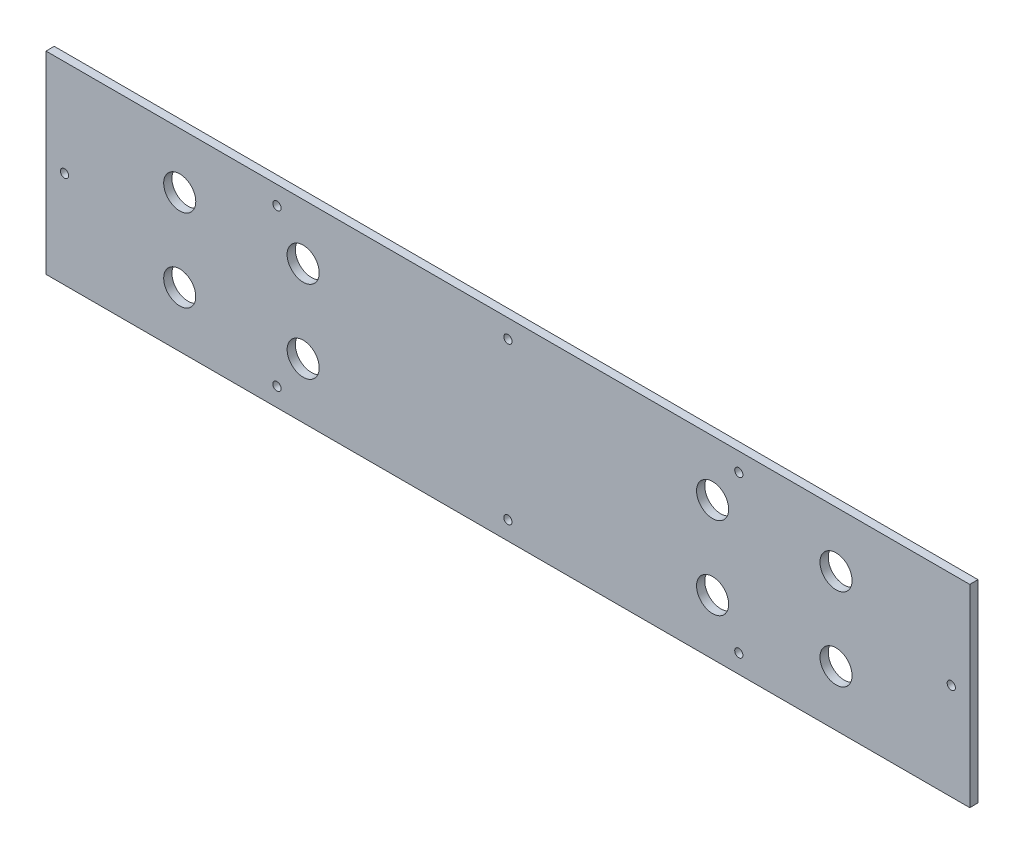
ISO-10303-21;
HEADER;
FILE_DESCRIPTION(('STEP AP214'),'2;1');
FILE_NAME('part.step','',(''),(''),'','','');
FILE_SCHEMA(('AUTOMOTIVE_DESIGN { 1 0 10303 214 1 1 1 1 }'));
ENDSEC;
DATA;
#1=APPLICATION_CONTEXT('core data for automotive mechanical design processes');
#2=APPLICATION_PROTOCOL_DEFINITION('international standard','automotive_design',2000,#1);
#3=PRODUCT_CONTEXT('',#1,'mechanical');
#4=PRODUCT('Part','Part','',(#3));
#5=PRODUCT_RELATED_PRODUCT_CATEGORY('part','',(#4));
#6=PRODUCT_DEFINITION_FORMATION('','',#4);
#7=PRODUCT_DEFINITION_CONTEXT('part definition',#1,'design');
#8=PRODUCT_DEFINITION('design','',#6,#7);
#9=PRODUCT_DEFINITION_SHAPE('','',#8);
#10=(LENGTH_UNIT() NAMED_UNIT(*) SI_UNIT(.MILLI.,.METRE.));
#11=(NAMED_UNIT(*) PLANE_ANGLE_UNIT() SI_UNIT($,.RADIAN.));
#12=(NAMED_UNIT(*) SI_UNIT($,.STERADIAN.) SOLID_ANGLE_UNIT());
#13=UNCERTAINTY_MEASURE_WITH_UNIT(LENGTH_MEASURE(1.E-05),#10,'distance_accuracy_value','');
#14=(GEOMETRIC_REPRESENTATION_CONTEXT(3) GLOBAL_UNCERTAINTY_ASSIGNED_CONTEXT((#13)) GLOBAL_UNIT_ASSIGNED_CONTEXT((#10,
#11,#12)) REPRESENTATION_CONTEXT('',''));
#15=CARTESIAN_POINT('',(0.,0.,0.));
#16=DIRECTION('',(0.,0.,1.));
#17=DIRECTION('',(1.,0.,0.));
#18=AXIS2_PLACEMENT_3D('',#15,#16,#17);
#19=CARTESIAN_POINT('',(0.,0.,4.));
#20=DIRECTION('',(0.,0.,1.));
#21=DIRECTION('',(1.,0.,0.));
#22=AXIS2_PLACEMENT_3D('',#19,#20,#21);
#23=PLANE('',#22);
#24=CARTESIAN_POINT('',(-125.,26.9999999999999,4.));
#25=DIRECTION('',(0.,0.,1.));
#26=DIRECTION('',(-1.,0.,0.));
#27=AXIS2_PLACEMENT_3D('',#24,#25,#26);
#28=CIRCLE('',#27,7.8);
#29=CARTESIAN_POINT('',(-132.8,26.9999999999999,4.));
#30=VERTEX_POINT('',#29);
#31=EDGE_CURVE('E195',#30,#30,#28,.T.);
#32=ORIENTED_EDGE('',*,*,#31,.F.);
#33=EDGE_LOOP('',(#32));
#34=FACE_BOUND('',#33,.T.);
#35=CARTESIAN_POINT('',(-65.,66.9999999999999,4.));
#36=DIRECTION('',(0.,0.,1.));
#37=DIRECTION('',(1.,0.,0.));
#38=AXIS2_PLACEMENT_3D('',#35,#36,#37);
#39=CIRCLE('',#38,7.8);
#40=CARTESIAN_POINT('',(-57.2,66.9999999999999,4.));
#41=VERTEX_POINT('',#40);
#42=EDGE_CURVE('E183',#41,#41,#39,.T.);
#43=ORIENTED_EDGE('',*,*,#42,.F.);
#44=EDGE_LOOP('',(#43));
#45=FACE_BOUND('',#44,.T.);
#46=CARTESIAN_POINT('',(-112.25,8.99999999999618,4.));
#47=DIRECTION('',(0.,0.,1.));
#48=DIRECTION('',(1.,0.,0.));
#49=AXIS2_PLACEMENT_3D('',#46,#47,#48);
#50=CIRCLE('',#49,2.);
#51=CARTESIAN_POINT('',(-110.25,8.99999999999618,4.));
#52=VERTEX_POINT('',#51);
#53=EDGE_CURVE('E171',#52,#52,#50,.T.);
#54=ORIENTED_EDGE('',*,*,#53,.F.);
#55=EDGE_LOOP('',(#54));
#56=FACE_BOUND('',#55,.T.);
#57=CARTESIAN_POINT('',(-336.75,85.0000000000039,4.));
#58=DIRECTION('',(0.,0.,1.));
#59=DIRECTION('',(1.,0.,0.));
#60=AXIS2_PLACEMENT_3D('',#57,#58,#59);
#61=CIRCLE('',#60,2.);
#62=CARTESIAN_POINT('',(-334.75,85.0000000000039,4.));
#63=VERTEX_POINT('',#62);
#64=EDGE_CURVE('E159',#63,#63,#61,.T.);
#65=ORIENTED_EDGE('',*,*,#64,.F.);
#66=EDGE_LOOP('',(#65));
#67=FACE_BOUND('',#66,.T.);
#68=CARTESIAN_POINT('',(-384.,66.9999999999999,4.));
#69=DIRECTION('',(0.,0.,1.));
#70=DIRECTION('',(1.,0.,0.));
#71=AXIS2_PLACEMENT_3D('',#68,#69,#70);
#72=CIRCLE('',#71,7.79999999999999);
#73=CARTESIAN_POINT('',(-376.2,66.9999999999999,4.));
#74=VERTEX_POINT('',#73);
#75=EDGE_CURVE('E147',#74,#74,#72,.T.);
#76=ORIENTED_EDGE('',*,*,#75,.F.);
#77=EDGE_LOOP('',(#76));
#78=FACE_BOUND('',#77,.T.);
#79=CARTESIAN_POINT('',(-224.5,8.99999999999998,4.));
#80=DIRECTION('',(0.,0.,1.));
#81=DIRECTION('',(-1.,0.,0.));
#82=AXIS2_PLACEMENT_3D('',#79,#80,#81);
#83=CIRCLE('',#82,2.);
#84=CARTESIAN_POINT('',(-226.5,8.99999999999998,4.));
#85=VERTEX_POINT('',#84);
#86=EDGE_CURVE('E135',#85,#85,#83,.T.);
#87=ORIENTED_EDGE('',*,*,#86,.F.);
#88=EDGE_LOOP('',(#87));
#89=FACE_BOUND('',#88,.T.);
#90=CARTESIAN_POINT('',(-9.,46.9999999999999,4.));
#91=DIRECTION('',(0.,0.,1.));
#92=DIRECTION('',(1.,0.,0.));
#93=AXIS2_PLACEMENT_3D('',#90,#91,#92);
#94=CIRCLE('',#93,2.);
#95=CARTESIAN_POINT('',(-7.,46.9999999999999,4.));
#96=VERTEX_POINT('',#95);
#97=EDGE_CURVE('E123',#96,#96,#94,.T.);
#98=ORIENTED_EDGE('',*,*,#97,.F.);
#99=EDGE_LOOP('',(#98));
#100=FACE_BOUND('',#99,.T.);
#101=CARTESIAN_POINT('',(-384.,26.9999999999999,4.));
#102=DIRECTION('',(0.,0.,1.));
#103=DIRECTION('',(-1.,0.,0.));
#104=AXIS2_PLACEMENT_3D('',#101,#102,#103);
#105=CIRCLE('',#104,7.79999999999999);
#106=CARTESIAN_POINT('',(-391.8,26.9999999999999,4.));
#107=VERTEX_POINT('',#106);
#108=EDGE_CURVE('E102',#107,#107,#105,.T.);
#109=ORIENTED_EDGE('',*,*,#108,.F.);
#110=EDGE_LOOP('',(#109));
#111=FACE_BOUND('',#110,.T.);
#112=DIRECTION('',(0.,1.,0.));
#113=VECTOR('',#112,1.);
#114=CARTESIAN_POINT('',(0.,0.,4.));
#115=LINE('',#114,#113);
#116=CARTESIAN_POINT('',(0.,0.,4.));
#117=VERTEX_POINT('',#116);
#118=CARTESIAN_POINT('',(0.,93.9999999999999,4.));
#119=VERTEX_POINT('',#118);
#120=EDGE_CURVE('E87',#117,#119,#115,.T.);
#121=ORIENTED_EDGE('',*,*,#120,.T.);
#122=DIRECTION('',(-1.,0.,0.));
#123=VECTOR('',#122,1.);
#124=CARTESIAN_POINT('',(0.,93.9999999999999,4.));
#125=LINE('',#124,#123);
#126=CARTESIAN_POINT('',(-449.,93.9999999999999,4.));
#127=VERTEX_POINT('',#126);
#128=EDGE_CURVE('E82',#119,#127,#125,.T.);
#129=ORIENTED_EDGE('',*,*,#128,.T.);
#130=DIRECTION('',(0.,-1.,0.));
#131=VECTOR('',#130,1.);
#132=CARTESIAN_POINT('',(-449.,0.,4.));
#133=LINE('',#132,#131);
#134=CARTESIAN_POINT('',(-449.,0.,4.));
#135=VERTEX_POINT('',#134);
#136=EDGE_CURVE('E85',#127,#135,#133,.T.);
#137=ORIENTED_EDGE('',*,*,#136,.T.);
#138=DIRECTION('',(1.,0.,0.));
#139=VECTOR('',#138,1.);
#140=CARTESIAN_POINT('',(0.,0.,4.));
#141=LINE('',#140,#139);
#142=EDGE_CURVE('E52',#135,#117,#141,.T.);
#143=ORIENTED_EDGE('',*,*,#142,.T.);
#144=EDGE_LOOP('',(#121,#129,#137,#143));
#145=FACE_BOUND('',#144,.T.);
#146=CARTESIAN_POINT('',(-224.5,84.9999999999999,4.));
#147=DIRECTION('',(0.,0.,1.));
#148=DIRECTION('',(1.,0.,0.));
#149=AXIS2_PLACEMENT_3D('',#146,#147,#148);
#150=CIRCLE('',#149,2.);
#151=CARTESIAN_POINT('',(-222.5,84.9999999999999,4.));
#152=VERTEX_POINT('',#151);
#153=EDGE_CURVE('E117',#152,#152,#150,.T.);
#154=ORIENTED_EDGE('',*,*,#153,.F.);
#155=EDGE_LOOP('',(#154));
#156=FACE_BOUND('',#155,.T.);
#157=CARTESIAN_POINT('',(-440.,46.9999999999999,4.));
#158=DIRECTION('',(0.,0.,1.));
#159=DIRECTION('',(-1.,0.,0.));
#160=AXIS2_PLACEMENT_3D('',#157,#158,#159);
#161=CIRCLE('',#160,2.);
#162=CARTESIAN_POINT('',(-442.,46.9999999999999,4.));
#163=VERTEX_POINT('',#162);
#164=EDGE_CURVE('E129',#163,#163,#161,.T.);
#165=ORIENTED_EDGE('',*,*,#164,.F.);
#166=EDGE_LOOP('',(#165));
#167=FACE_BOUND('',#166,.T.);
#168=CARTESIAN_POINT('',(-324.,26.9999999999999,4.));
#169=DIRECTION('',(0.,0.,1.));
#170=DIRECTION('',(1.,0.,0.));
#171=AXIS2_PLACEMENT_3D('',#168,#169,#170);
#172=CIRCLE('',#171,7.79999999999999);
#173=CARTESIAN_POINT('',(-316.2,26.9999999999999,4.));
#174=VERTEX_POINT('',#173);
#175=EDGE_CURVE('E141',#174,#174,#172,.T.);
#176=ORIENTED_EDGE('',*,*,#175,.F.);
#177=EDGE_LOOP('',(#176));
#178=FACE_BOUND('',#177,.T.);
#179=CARTESIAN_POINT('',(-324.,66.9999999999999,4.));
#180=DIRECTION('',(0.,0.,1.));
#181=DIRECTION('',(-1.,0.,0.));
#182=AXIS2_PLACEMENT_3D('',#179,#180,#181);
#183=CIRCLE('',#182,7.79999999999999);
#184=CARTESIAN_POINT('',(-331.8,66.9999999999999,4.));
#185=VERTEX_POINT('',#184);
#186=EDGE_CURVE('E153',#185,#185,#183,.T.);
#187=ORIENTED_EDGE('',*,*,#186,.F.);
#188=EDGE_LOOP('',(#187));
#189=FACE_BOUND('',#188,.T.);
#190=CARTESIAN_POINT('',(-336.75,8.99999999999596,4.));
#191=DIRECTION('',(0.,0.,1.));
#192=DIRECTION('',(-1.,0.,0.));
#193=AXIS2_PLACEMENT_3D('',#190,#191,#192);
#194=CIRCLE('',#193,2.);
#195=CARTESIAN_POINT('',(-338.75,8.99999999999596,4.));
#196=VERTEX_POINT('',#195);
#197=EDGE_CURVE('E165',#196,#196,#194,.T.);
#198=ORIENTED_EDGE('',*,*,#197,.F.);
#199=EDGE_LOOP('',(#198));
#200=FACE_BOUND('',#199,.T.);
#201=CARTESIAN_POINT('',(-112.25,85.0000000000041,4.));
#202=DIRECTION('',(0.,0.,1.));
#203=DIRECTION('',(-1.,0.,0.));
#204=AXIS2_PLACEMENT_3D('',#201,#202,#203);
#205=CIRCLE('',#204,2.);
#206=CARTESIAN_POINT('',(-114.25,85.0000000000041,4.));
#207=VERTEX_POINT('',#206);
#208=EDGE_CURVE('E177',#207,#207,#205,.T.);
#209=ORIENTED_EDGE('',*,*,#208,.F.);
#210=EDGE_LOOP('',(#209));
#211=FACE_BOUND('',#210,.T.);
#212=CARTESIAN_POINT('',(-65.,26.9999999999999,4.));
#213=DIRECTION('',(0.,0.,1.));
#214=DIRECTION('',(1.,0.,0.));
#215=AXIS2_PLACEMENT_3D('',#212,#213,#214);
#216=CIRCLE('',#215,7.8);
#217=CARTESIAN_POINT('',(-57.2,26.9999999999999,4.));
#218=VERTEX_POINT('',#217);
#219=EDGE_CURVE('E189',#218,#218,#216,.T.);
#220=ORIENTED_EDGE('',*,*,#219,.F.);
#221=EDGE_LOOP('',(#220));
#222=FACE_BOUND('',#221,.T.);
#223=CARTESIAN_POINT('',(-125.,66.9999999999999,4.));
#224=DIRECTION('',(0.,0.,1.));
#225=DIRECTION('',(-1.,0.,0.));
#226=AXIS2_PLACEMENT_3D('',#223,#224,#225);
#227=CIRCLE('',#226,7.8);
#228=CARTESIAN_POINT('',(-132.8,66.9999999999999,4.));
#229=VERTEX_POINT('',#228);
#230=EDGE_CURVE('E201',#229,#229,#227,.T.);
#231=ORIENTED_EDGE('',*,*,#230,.F.);
#232=EDGE_LOOP('',(#231));
#233=FACE_BOUND('',#232,.T.);
#234=ADVANCED_FACE('F35',(#34,#45,#56,#67,#78,#89,#100,#111,#145,#156,#167,#178,#189,#200,#211,
#222,#233),#23,.T.);
#235=CARTESIAN_POINT('',(0.,0.,0.));
#236=DIRECTION('',(0.,0.,1.));
#237=DIRECTION('',(1.,0.,0.));
#238=AXIS2_PLACEMENT_3D('',#235,#236,#237);
#239=PLANE('',#238);
#240=CARTESIAN_POINT('',(-125.,26.9999999999999,0.));
#241=DIRECTION('',(0.,0.,1.));
#242=DIRECTION('',(-1.,0.,0.));
#243=AXIS2_PLACEMENT_3D('',#240,#241,#242);
#244=CIRCLE('',#243,7.8);
#245=CARTESIAN_POINT('',(-132.8,26.9999999999999,0.));
#246=VERTEX_POINT('',#245);
#247=EDGE_CURVE('E198',#246,#246,#244,.T.);
#248=ORIENTED_EDGE('',*,*,#247,.T.);
#249=EDGE_LOOP('',(#248));
#250=FACE_BOUND('',#249,.T.);
#251=CARTESIAN_POINT('',(-65.,66.9999999999999,0.));
#252=DIRECTION('',(0.,0.,1.));
#253=DIRECTION('',(1.,0.,0.));
#254=AXIS2_PLACEMENT_3D('',#251,#252,#253);
#255=CIRCLE('',#254,7.8);
#256=CARTESIAN_POINT('',(-57.2,66.9999999999999,0.));
#257=VERTEX_POINT('',#256);
#258=EDGE_CURVE('E186',#257,#257,#255,.T.);
#259=ORIENTED_EDGE('',*,*,#258,.T.);
#260=EDGE_LOOP('',(#259));
#261=FACE_BOUND('',#260,.T.);
#262=CARTESIAN_POINT('',(-112.25,8.99999999999618,0.));
#263=DIRECTION('',(0.,0.,1.));
#264=DIRECTION('',(1.,0.,0.));
#265=AXIS2_PLACEMENT_3D('',#262,#263,#264);
#266=CIRCLE('',#265,2.);
#267=CARTESIAN_POINT('',(-110.25,8.99999999999618,0.));
#268=VERTEX_POINT('',#267);
#269=EDGE_CURVE('E174',#268,#268,#266,.T.);
#270=ORIENTED_EDGE('',*,*,#269,.T.);
#271=EDGE_LOOP('',(#270));
#272=FACE_BOUND('',#271,.T.);
#273=CARTESIAN_POINT('',(-336.75,85.0000000000039,0.));
#274=DIRECTION('',(0.,0.,1.));
#275=DIRECTION('',(1.,0.,0.));
#276=AXIS2_PLACEMENT_3D('',#273,#274,#275);
#277=CIRCLE('',#276,2.);
#278=CARTESIAN_POINT('',(-334.75,85.0000000000039,0.));
#279=VERTEX_POINT('',#278);
#280=EDGE_CURVE('E162',#279,#279,#277,.T.);
#281=ORIENTED_EDGE('',*,*,#280,.T.);
#282=EDGE_LOOP('',(#281));
#283=FACE_BOUND('',#282,.T.);
#284=CARTESIAN_POINT('',(-384.,66.9999999999999,0.));
#285=DIRECTION('',(0.,0.,1.));
#286=DIRECTION('',(1.,0.,0.));
#287=AXIS2_PLACEMENT_3D('',#284,#285,#286);
#288=CIRCLE('',#287,7.79999999999999);
#289=CARTESIAN_POINT('',(-376.2,66.9999999999999,0.));
#290=VERTEX_POINT('',#289);
#291=EDGE_CURVE('E150',#290,#290,#288,.T.);
#292=ORIENTED_EDGE('',*,*,#291,.T.);
#293=EDGE_LOOP('',(#292));
#294=FACE_BOUND('',#293,.T.);
#295=CARTESIAN_POINT('',(-224.5,8.99999999999998,0.));
#296=DIRECTION('',(0.,0.,1.));
#297=DIRECTION('',(-1.,0.,0.));
#298=AXIS2_PLACEMENT_3D('',#295,#296,#297);
#299=CIRCLE('',#298,2.);
#300=CARTESIAN_POINT('',(-226.5,8.99999999999998,0.));
#301=VERTEX_POINT('',#300);
#302=EDGE_CURVE('E138',#301,#301,#299,.T.);
#303=ORIENTED_EDGE('',*,*,#302,.T.);
#304=EDGE_LOOP('',(#303));
#305=FACE_BOUND('',#304,.T.);
#306=CARTESIAN_POINT('',(-9.,46.9999999999999,0.));
#307=DIRECTION('',(0.,0.,1.));
#308=DIRECTION('',(1.,0.,0.));
#309=AXIS2_PLACEMENT_3D('',#306,#307,#308);
#310=CIRCLE('',#309,2.);
#311=CARTESIAN_POINT('',(-7.,46.9999999999999,0.));
#312=VERTEX_POINT('',#311);
#313=EDGE_CURVE('E126',#312,#312,#310,.T.);
#314=ORIENTED_EDGE('',*,*,#313,.T.);
#315=EDGE_LOOP('',(#314));
#316=FACE_BOUND('',#315,.T.);
#317=CARTESIAN_POINT('',(-384.,26.9999999999999,0.));
#318=DIRECTION('',(0.,0.,1.));
#319=DIRECTION('',(-1.,0.,0.));
#320=AXIS2_PLACEMENT_3D('',#317,#318,#319);
#321=CIRCLE('',#320,7.79999999999999);
#322=CARTESIAN_POINT('',(-391.8,26.9999999999999,0.));
#323=VERTEX_POINT('',#322);
#324=EDGE_CURVE('E114',#323,#323,#321,.T.);
#325=ORIENTED_EDGE('',*,*,#324,.T.);
#326=EDGE_LOOP('',(#325));
#327=FACE_BOUND('',#326,.T.);
#328=DIRECTION('',(0.,1.,0.));
#329=VECTOR('',#328,1.);
#330=CARTESIAN_POINT('',(0.,0.,0.));
#331=LINE('',#330,#329);
#332=CARTESIAN_POINT('',(0.,0.,0.));
#333=VERTEX_POINT('',#332);
#334=CARTESIAN_POINT('',(0.,93.9999999999999,0.));
#335=VERTEX_POINT('',#334);
#336=EDGE_CURVE('E99',#333,#335,#331,.T.);
#337=ORIENTED_EDGE('',*,*,#336,.F.);
#338=DIRECTION('',(1.,0.,0.));
#339=VECTOR('',#338,1.);
#340=CARTESIAN_POINT('',(0.,0.,0.));
#341=LINE('',#340,#339);
#342=CARTESIAN_POINT('',(-449.,0.,0.));
#343=VERTEX_POINT('',#342);
#344=EDGE_CURVE('E75',#343,#333,#341,.T.);
#345=ORIENTED_EDGE('',*,*,#344,.F.);
#346=DIRECTION('',(0.,-1.,0.));
#347=VECTOR('',#346,1.);
#348=CARTESIAN_POINT('',(-449.,0.,0.));
#349=LINE('',#348,#347);
#350=CARTESIAN_POINT('',(-449.,93.9999999999999,0.));
#351=VERTEX_POINT('',#350);
#352=EDGE_CURVE('E69',#351,#343,#349,.T.);
#353=ORIENTED_EDGE('',*,*,#352,.F.);
#354=DIRECTION('',(-1.,0.,0.));
#355=VECTOR('',#354,1.);
#356=CARTESIAN_POINT('',(0.,93.9999999999999,0.));
#357=LINE('',#356,#355);
#358=EDGE_CURVE('E91',#335,#351,#357,.T.);
#359=ORIENTED_EDGE('',*,*,#358,.F.);
#360=EDGE_LOOP('',(#337,#345,#353,#359));
#361=FACE_BOUND('',#360,.T.);
#362=CARTESIAN_POINT('',(-224.5,84.9999999999999,0.));
#363=DIRECTION('',(0.,0.,1.));
#364=DIRECTION('',(1.,0.,0.));
#365=AXIS2_PLACEMENT_3D('',#362,#363,#364);
#366=CIRCLE('',#365,2.);
#367=CARTESIAN_POINT('',(-222.5,84.9999999999999,0.));
#368=VERTEX_POINT('',#367);
#369=EDGE_CURVE('E120',#368,#368,#366,.T.);
#370=ORIENTED_EDGE('',*,*,#369,.T.);
#371=EDGE_LOOP('',(#370));
#372=FACE_BOUND('',#371,.T.);
#373=CARTESIAN_POINT('',(-440.,46.9999999999999,0.));
#374=DIRECTION('',(0.,0.,1.));
#375=DIRECTION('',(-1.,0.,0.));
#376=AXIS2_PLACEMENT_3D('',#373,#374,#375);
#377=CIRCLE('',#376,2.);
#378=CARTESIAN_POINT('',(-442.,46.9999999999999,0.));
#379=VERTEX_POINT('',#378);
#380=EDGE_CURVE('E132',#379,#379,#377,.T.);
#381=ORIENTED_EDGE('',*,*,#380,.T.);
#382=EDGE_LOOP('',(#381));
#383=FACE_BOUND('',#382,.T.);
#384=CARTESIAN_POINT('',(-324.,26.9999999999999,0.));
#385=DIRECTION('',(0.,0.,1.));
#386=DIRECTION('',(1.,0.,0.));
#387=AXIS2_PLACEMENT_3D('',#384,#385,#386);
#388=CIRCLE('',#387,7.79999999999999);
#389=CARTESIAN_POINT('',(-316.2,26.9999999999999,0.));
#390=VERTEX_POINT('',#389);
#391=EDGE_CURVE('E144',#390,#390,#388,.T.);
#392=ORIENTED_EDGE('',*,*,#391,.T.);
#393=EDGE_LOOP('',(#392));
#394=FACE_BOUND('',#393,.T.);
#395=CARTESIAN_POINT('',(-324.,66.9999999999999,0.));
#396=DIRECTION('',(0.,0.,1.));
#397=DIRECTION('',(-1.,0.,0.));
#398=AXIS2_PLACEMENT_3D('',#395,#396,#397);
#399=CIRCLE('',#398,7.79999999999999);
#400=CARTESIAN_POINT('',(-331.8,66.9999999999999,0.));
#401=VERTEX_POINT('',#400);
#402=EDGE_CURVE('E156',#401,#401,#399,.T.);
#403=ORIENTED_EDGE('',*,*,#402,.T.);
#404=EDGE_LOOP('',(#403));
#405=FACE_BOUND('',#404,.T.);
#406=CARTESIAN_POINT('',(-336.75,8.99999999999596,0.));
#407=DIRECTION('',(0.,0.,1.));
#408=DIRECTION('',(-1.,0.,0.));
#409=AXIS2_PLACEMENT_3D('',#406,#407,#408);
#410=CIRCLE('',#409,2.);
#411=CARTESIAN_POINT('',(-338.75,8.99999999999596,0.));
#412=VERTEX_POINT('',#411);
#413=EDGE_CURVE('E168',#412,#412,#410,.T.);
#414=ORIENTED_EDGE('',*,*,#413,.T.);
#415=EDGE_LOOP('',(#414));
#416=FACE_BOUND('',#415,.T.);
#417=CARTESIAN_POINT('',(-112.25,85.0000000000041,0.));
#418=DIRECTION('',(0.,0.,1.));
#419=DIRECTION('',(-1.,0.,0.));
#420=AXIS2_PLACEMENT_3D('',#417,#418,#419);
#421=CIRCLE('',#420,2.);
#422=CARTESIAN_POINT('',(-114.25,85.0000000000041,0.));
#423=VERTEX_POINT('',#422);
#424=EDGE_CURVE('E180',#423,#423,#421,.T.);
#425=ORIENTED_EDGE('',*,*,#424,.T.);
#426=EDGE_LOOP('',(#425));
#427=FACE_BOUND('',#426,.T.);
#428=CARTESIAN_POINT('',(-65.,26.9999999999999,0.));
#429=DIRECTION('',(0.,0.,1.));
#430=DIRECTION('',(1.,0.,0.));
#431=AXIS2_PLACEMENT_3D('',#428,#429,#430);
#432=CIRCLE('',#431,7.8);
#433=CARTESIAN_POINT('',(-57.2,26.9999999999999,0.));
#434=VERTEX_POINT('',#433);
#435=EDGE_CURVE('E192',#434,#434,#432,.T.);
#436=ORIENTED_EDGE('',*,*,#435,.T.);
#437=EDGE_LOOP('',(#436));
#438=FACE_BOUND('',#437,.T.);
#439=CARTESIAN_POINT('',(-125.,66.9999999999999,0.));
#440=DIRECTION('',(0.,0.,1.));
#441=DIRECTION('',(-1.,0.,0.));
#442=AXIS2_PLACEMENT_3D('',#439,#440,#441);
#443=CIRCLE('',#442,7.8);
#444=CARTESIAN_POINT('',(-132.8,66.9999999999999,0.));
#445=VERTEX_POINT('',#444);
#446=EDGE_CURVE('E204',#445,#445,#443,.T.);
#447=ORIENTED_EDGE('',*,*,#446,.T.);
#448=EDGE_LOOP('',(#447));
#449=FACE_BOUND('',#448,.T.);
#450=ADVANCED_FACE('F110',(#250,#261,#272,#283,#294,#305,#316,#327,#361,#372,#383,#394,#405,
#416,#427,#438,#449),#239,.F.);
#451=CARTESIAN_POINT('',(0.,0.,4.));
#452=DIRECTION('',(-1.,0.,0.));
#453=DIRECTION('',(0.,0.,1.));
#454=AXIS2_PLACEMENT_3D('',#451,#452,#453);
#455=PLANE('',#454);
#456=ORIENTED_EDGE('',*,*,#336,.T.);
#457=DIRECTION('',(0.,0.,-1.));
#458=VECTOR('',#457,1.);
#459=CARTESIAN_POINT('',(0.,93.9999999999999,4.));
#460=LINE('',#459,#458);
#461=EDGE_CURVE('E11',#119,#335,#460,.T.);
#462=ORIENTED_EDGE('',*,*,#461,.F.);
#463=ORIENTED_EDGE('',*,*,#120,.F.);
#464=DIRECTION('',(0.,0.,-1.));
#465=VECTOR('',#464,1.);
#466=CARTESIAN_POINT('',(0.,0.,4.));
#467=LINE('',#466,#465);
#468=EDGE_CURVE('E95',#117,#333,#467,.T.);
#469=ORIENTED_EDGE('',*,*,#468,.T.);
#470=EDGE_LOOP('',(#456,#462,#463,#469));
#471=FACE_BOUND('',#470,.T.);
#472=ADVANCED_FACE('F37',(#471),#455,.F.);
#473=CARTESIAN_POINT('',(0.,93.9999999999999,4.));
#474=DIRECTION('',(0.,-1.,0.));
#475=DIRECTION('',(1.,0.,0.));
#476=AXIS2_PLACEMENT_3D('',#473,#474,#475);
#477=PLANE('',#476);
#478=ORIENTED_EDGE('',*,*,#358,.T.);
#479=DIRECTION('',(0.,0.,-1.));
#480=VECTOR('',#479,1.);
#481=CARTESIAN_POINT('',(-449.,93.9999999999999,4.));
#482=LINE('',#481,#480);
#483=EDGE_CURVE('E44',#127,#351,#482,.T.);
#484=ORIENTED_EDGE('',*,*,#483,.F.);
#485=ORIENTED_EDGE('',*,*,#128,.F.);
#486=ORIENTED_EDGE('',*,*,#461,.T.);
#487=EDGE_LOOP('',(#478,#484,#485,#486));
#488=FACE_BOUND('',#487,.T.);
#489=ADVANCED_FACE('F90',(#488),#477,.F.);
#490=CARTESIAN_POINT('',(-449.,0.,4.));
#491=DIRECTION('',(1.,0.,0.));
#492=DIRECTION('',(0.,1.,0.));
#493=AXIS2_PLACEMENT_3D('',#490,#491,#492);
#494=PLANE('',#493);
#495=ORIENTED_EDGE('',*,*,#352,.T.);
#496=DIRECTION('',(0.,0.,-1.));
#497=VECTOR('',#496,1.);
#498=CARTESIAN_POINT('',(-449.,0.,4.));
#499=LINE('',#498,#497);
#500=EDGE_CURVE('E92',#135,#343,#499,.T.);
#501=ORIENTED_EDGE('',*,*,#500,.F.);
#502=ORIENTED_EDGE('',*,*,#136,.F.);
#503=ORIENTED_EDGE('',*,*,#483,.T.);
#504=EDGE_LOOP('',(#495,#501,#502,#503));
#505=FACE_BOUND('',#504,.T.);
#506=ADVANCED_FACE('F93',(#505),#494,.F.);
#507=CARTESIAN_POINT('',(0.,0.,4.));
#508=DIRECTION('',(0.,1.,0.));
#509=DIRECTION('',(-1.,0.,0.));
#510=AXIS2_PLACEMENT_3D('',#507,#508,#509);
#511=PLANE('',#510);
#512=ORIENTED_EDGE('',*,*,#344,.T.);
#513=ORIENTED_EDGE('',*,*,#468,.F.);
#514=ORIENTED_EDGE('',*,*,#142,.F.);
#515=ORIENTED_EDGE('',*,*,#500,.T.);
#516=EDGE_LOOP('',(#512,#513,#514,#515));
#517=FACE_BOUND('',#516,.T.);
#518=ADVANCED_FACE('F107',(#517),#511,.F.);
#519=CARTESIAN_POINT('',(-384.,26.9999999999999,4.));
#520=DIRECTION('',(0.,0.,-1.));
#521=DIRECTION('',(-1.,0.,0.));
#522=AXIS2_PLACEMENT_3D('',#519,#520,#521);
#523=CYLINDRICAL_SURFACE('',#522,7.79999999999999);
#524=ORIENTED_EDGE('',*,*,#108,.T.);
#525=EDGE_LOOP('',(#524));
#526=FACE_BOUND('',#525,.T.);
#527=ORIENTED_EDGE('',*,*,#324,.F.);
#528=EDGE_LOOP('',(#527));
#529=FACE_BOUND('',#528,.T.);
#530=ADVANCED_FACE('F224',(#526,#529),#523,.F.);
#531=CARTESIAN_POINT('',(-224.5,84.9999999999999,4.));
#532=DIRECTION('',(0.,0.,-1.));
#533=DIRECTION('',(-1.,0.,0.));
#534=AXIS2_PLACEMENT_3D('',#531,#532,#533);
#535=CYLINDRICAL_SURFACE('',#534,2.);
#536=ORIENTED_EDGE('',*,*,#153,.T.);
#537=EDGE_LOOP('',(#536));
#538=FACE_BOUND('',#537,.T.);
#539=ORIENTED_EDGE('',*,*,#369,.F.);
#540=EDGE_LOOP('',(#539));
#541=FACE_BOUND('',#540,.T.);
#542=ADVANCED_FACE('F272',(#538,#541),#535,.F.);
#543=CARTESIAN_POINT('',(-9.,46.9999999999999,4.));
#544=DIRECTION('',(0.,0.,-1.));
#545=DIRECTION('',(-1.,0.,0.));
#546=AXIS2_PLACEMENT_3D('',#543,#544,#545);
#547=CYLINDRICAL_SURFACE('',#546,2.);
#548=ORIENTED_EDGE('',*,*,#97,.T.);
#549=EDGE_LOOP('',(#548));
#550=FACE_BOUND('',#549,.T.);
#551=ORIENTED_EDGE('',*,*,#313,.F.);
#552=EDGE_LOOP('',(#551));
#553=FACE_BOUND('',#552,.T.);
#554=ADVANCED_FACE('F280',(#550,#553),#547,.F.);
#555=CARTESIAN_POINT('',(-440.,46.9999999999999,4.));
#556=DIRECTION('',(0.,0.,-1.));
#557=DIRECTION('',(-1.,0.,0.));
#558=AXIS2_PLACEMENT_3D('',#555,#556,#557);
#559=CYLINDRICAL_SURFACE('',#558,2.);
#560=ORIENTED_EDGE('',*,*,#164,.T.);
#561=EDGE_LOOP('',(#560));
#562=FACE_BOUND('',#561,.T.);
#563=ORIENTED_EDGE('',*,*,#380,.F.);
#564=EDGE_LOOP('',(#563));
#565=FACE_BOUND('',#564,.T.);
#566=ADVANCED_FACE('F288',(#562,#565),#559,.F.);
#567=CARTESIAN_POINT('',(-224.5,8.99999999999998,4.));
#568=DIRECTION('',(0.,0.,-1.));
#569=DIRECTION('',(-1.,0.,0.));
#570=AXIS2_PLACEMENT_3D('',#567,#568,#569);
#571=CYLINDRICAL_SURFACE('',#570,2.);
#572=ORIENTED_EDGE('',*,*,#86,.T.);
#573=EDGE_LOOP('',(#572));
#574=FACE_BOUND('',#573,.T.);
#575=ORIENTED_EDGE('',*,*,#302,.F.);
#576=EDGE_LOOP('',(#575));
#577=FACE_BOUND('',#576,.T.);
#578=ADVANCED_FACE('F297',(#574,#577),#571,.F.);
#579=CARTESIAN_POINT('',(-324.,26.9999999999999,4.));
#580=DIRECTION('',(0.,0.,-1.));
#581=DIRECTION('',(-1.,0.,0.));
#582=AXIS2_PLACEMENT_3D('',#579,#580,#581);
#583=CYLINDRICAL_SURFACE('',#582,7.79999999999999);
#584=ORIENTED_EDGE('',*,*,#175,.T.);
#585=EDGE_LOOP('',(#584));
#586=FACE_BOUND('',#585,.T.);
#587=ORIENTED_EDGE('',*,*,#391,.F.);
#588=EDGE_LOOP('',(#587));
#589=FACE_BOUND('',#588,.T.);
#590=ADVANCED_FACE('F306',(#586,#589),#583,.F.);
#591=CARTESIAN_POINT('',(-384.,66.9999999999999,4.));
#592=DIRECTION('',(0.,0.,-1.));
#593=DIRECTION('',(-1.,0.,0.));
#594=AXIS2_PLACEMENT_3D('',#591,#592,#593);
#595=CYLINDRICAL_SURFACE('',#594,7.79999999999999);
#596=ORIENTED_EDGE('',*,*,#75,.T.);
#597=EDGE_LOOP('',(#596));
#598=FACE_BOUND('',#597,.T.);
#599=ORIENTED_EDGE('',*,*,#291,.F.);
#600=EDGE_LOOP('',(#599));
#601=FACE_BOUND('',#600,.T.);
#602=ADVANCED_FACE('F315',(#598,#601),#595,.F.);
#603=CARTESIAN_POINT('',(-324.,66.9999999999999,4.));
#604=DIRECTION('',(0.,0.,-1.));
#605=DIRECTION('',(-1.,0.,0.));
#606=AXIS2_PLACEMENT_3D('',#603,#604,#605);
#607=CYLINDRICAL_SURFACE('',#606,7.79999999999999);
#608=ORIENTED_EDGE('',*,*,#186,.T.);
#609=EDGE_LOOP('',(#608));
#610=FACE_BOUND('',#609,.T.);
#611=ORIENTED_EDGE('',*,*,#402,.F.);
#612=EDGE_LOOP('',(#611));
#613=FACE_BOUND('',#612,.T.);
#614=ADVANCED_FACE('F324',(#610,#613),#607,.F.);
#615=CARTESIAN_POINT('',(-336.75,85.0000000000039,4.));
#616=DIRECTION('',(0.,0.,-1.));
#617=DIRECTION('',(-1.,0.,0.));
#618=AXIS2_PLACEMENT_3D('',#615,#616,#617);
#619=CYLINDRICAL_SURFACE('',#618,2.);
#620=ORIENTED_EDGE('',*,*,#64,.T.);
#621=EDGE_LOOP('',(#620));
#622=FACE_BOUND('',#621,.T.);
#623=ORIENTED_EDGE('',*,*,#280,.F.);
#624=EDGE_LOOP('',(#623));
#625=FACE_BOUND('',#624,.T.);
#626=ADVANCED_FACE('F333',(#622,#625),#619,.F.);
#627=CARTESIAN_POINT('',(-336.75,8.99999999999596,4.));
#628=DIRECTION('',(0.,0.,-1.));
#629=DIRECTION('',(-1.,0.,0.));
#630=AXIS2_PLACEMENT_3D('',#627,#628,#629);
#631=CYLINDRICAL_SURFACE('',#630,2.);
#632=ORIENTED_EDGE('',*,*,#197,.T.);
#633=EDGE_LOOP('',(#632));
#634=FACE_BOUND('',#633,.T.);
#635=ORIENTED_EDGE('',*,*,#413,.F.);
#636=EDGE_LOOP('',(#635));
#637=FACE_BOUND('',#636,.T.);
#638=ADVANCED_FACE('F342',(#634,#637),#631,.F.);
#639=CARTESIAN_POINT('',(-112.25,8.99999999999618,4.));
#640=DIRECTION('',(0.,0.,-1.));
#641=DIRECTION('',(-1.,0.,0.));
#642=AXIS2_PLACEMENT_3D('',#639,#640,#641);
#643=CYLINDRICAL_SURFACE('',#642,2.);
#644=ORIENTED_EDGE('',*,*,#53,.T.);
#645=EDGE_LOOP('',(#644));
#646=FACE_BOUND('',#645,.T.);
#647=ORIENTED_EDGE('',*,*,#269,.F.);
#648=EDGE_LOOP('',(#647));
#649=FACE_BOUND('',#648,.T.);
#650=ADVANCED_FACE('F351',(#646,#649),#643,.F.);
#651=CARTESIAN_POINT('',(-112.25,85.0000000000041,4.));
#652=DIRECTION('',(0.,0.,-1.));
#653=DIRECTION('',(-1.,0.,0.));
#654=AXIS2_PLACEMENT_3D('',#651,#652,#653);
#655=CYLINDRICAL_SURFACE('',#654,2.);
#656=ORIENTED_EDGE('',*,*,#208,.T.);
#657=EDGE_LOOP('',(#656));
#658=FACE_BOUND('',#657,.T.);
#659=ORIENTED_EDGE('',*,*,#424,.F.);
#660=EDGE_LOOP('',(#659));
#661=FACE_BOUND('',#660,.T.);
#662=ADVANCED_FACE('F360',(#658,#661),#655,.F.);
#663=CARTESIAN_POINT('',(-65.,66.9999999999999,4.));
#664=DIRECTION('',(0.,0.,-1.));
#665=DIRECTION('',(-1.,0.,0.));
#666=AXIS2_PLACEMENT_3D('',#663,#664,#665);
#667=CYLINDRICAL_SURFACE('',#666,7.8);
#668=ORIENTED_EDGE('',*,*,#42,.T.);
#669=EDGE_LOOP('',(#668));
#670=FACE_BOUND('',#669,.T.);
#671=ORIENTED_EDGE('',*,*,#258,.F.);
#672=EDGE_LOOP('',(#671));
#673=FACE_BOUND('',#672,.T.);
#674=ADVANCED_FACE('F369',(#670,#673),#667,.F.);
#675=CARTESIAN_POINT('',(-65.,26.9999999999999,4.));
#676=DIRECTION('',(0.,0.,-1.));
#677=DIRECTION('',(-1.,0.,0.));
#678=AXIS2_PLACEMENT_3D('',#675,#676,#677);
#679=CYLINDRICAL_SURFACE('',#678,7.8);
#680=ORIENTED_EDGE('',*,*,#219,.T.);
#681=EDGE_LOOP('',(#680));
#682=FACE_BOUND('',#681,.T.);
#683=ORIENTED_EDGE('',*,*,#435,.F.);
#684=EDGE_LOOP('',(#683));
#685=FACE_BOUND('',#684,.T.);
#686=ADVANCED_FACE('F378',(#682,#685),#679,.F.);
#687=CARTESIAN_POINT('',(-125.,26.9999999999999,4.));
#688=DIRECTION('',(0.,0.,-1.));
#689=DIRECTION('',(-1.,0.,0.));
#690=AXIS2_PLACEMENT_3D('',#687,#688,#689);
#691=CYLINDRICAL_SURFACE('',#690,7.8);
#692=ORIENTED_EDGE('',*,*,#31,.T.);
#693=EDGE_LOOP('',(#692));
#694=FACE_BOUND('',#693,.T.);
#695=ORIENTED_EDGE('',*,*,#247,.F.);
#696=EDGE_LOOP('',(#695));
#697=FACE_BOUND('',#696,.T.);
#698=ADVANCED_FACE('F387',(#694,#697),#691,.F.);
#699=CARTESIAN_POINT('',(-125.,66.9999999999999,4.));
#700=DIRECTION('',(0.,0.,-1.));
#701=DIRECTION('',(-1.,0.,0.));
#702=AXIS2_PLACEMENT_3D('',#699,#700,#701);
#703=CYLINDRICAL_SURFACE('',#702,7.8);
#704=ORIENTED_EDGE('',*,*,#230,.T.);
#705=EDGE_LOOP('',(#704));
#706=FACE_BOUND('',#705,.T.);
#707=ORIENTED_EDGE('',*,*,#446,.F.);
#708=EDGE_LOOP('',(#707));
#709=FACE_BOUND('',#708,.T.);
#710=ADVANCED_FACE('F210',(#706,#709),#703,.F.);
#711=CLOSED_SHELL('',(#234,#450,#472,#489,#506,#518,#530,#542,#554,#566,#578,#590,#602,#614,
#626,#638,#650,#662,#674,#686,#698,#710));
#712=MANIFOLD_SOLID_BREP('B2',#711);
#713=ADVANCED_BREP_SHAPE_REPRESENTATION('',(#18,#712),#14);
#714=SHAPE_DEFINITION_REPRESENTATION(#9,#713);
ENDSEC;
END-ISO-10303-21;
